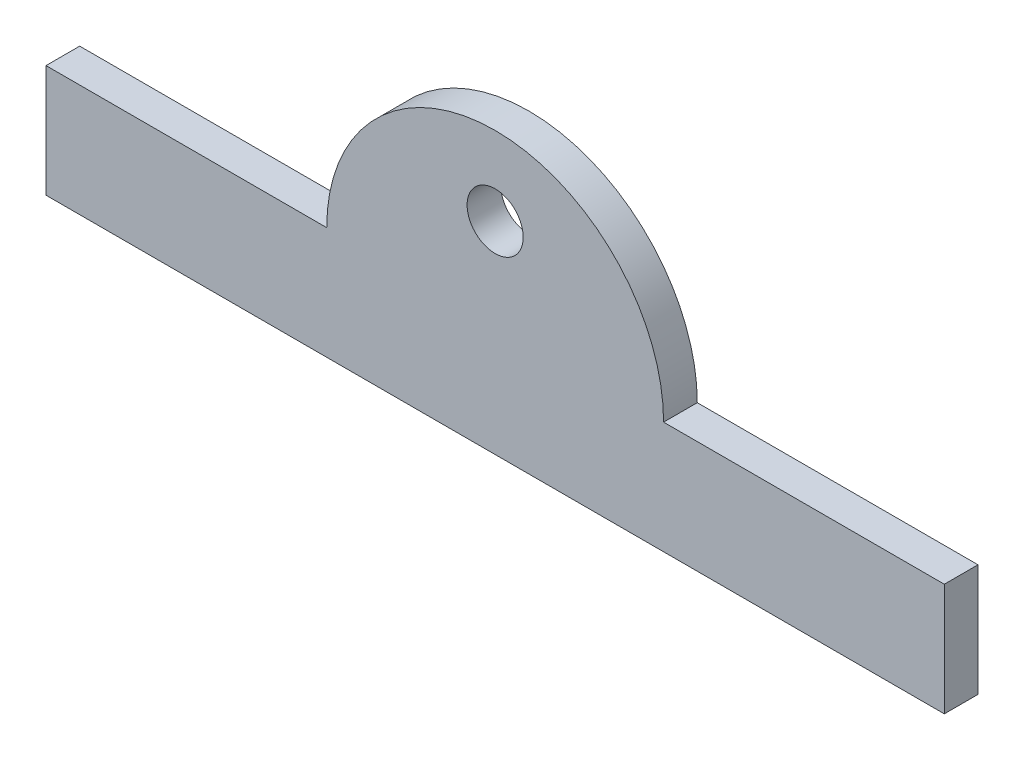
ISO-10303-21;
HEADER;
FILE_DESCRIPTION(('STEP AP214'),'2;1');
FILE_NAME('part.step','',(''),(''),'','','');
FILE_SCHEMA(('AUTOMOTIVE_DESIGN { 1 0 10303 214 1 1 1 1 }'));
ENDSEC;
DATA;
#1=APPLICATION_CONTEXT('core data for automotive mechanical design processes');
#2=APPLICATION_PROTOCOL_DEFINITION('international standard','automotive_design',2000,#1);
#3=PRODUCT_CONTEXT('',#1,'mechanical');
#4=PRODUCT('Part','Part','',(#3));
#5=PRODUCT_RELATED_PRODUCT_CATEGORY('part','',(#4));
#6=PRODUCT_DEFINITION_FORMATION('','',#4);
#7=PRODUCT_DEFINITION_CONTEXT('part definition',#1,'design');
#8=PRODUCT_DEFINITION('design','',#6,#7);
#9=PRODUCT_DEFINITION_SHAPE('','',#8);
#10=(LENGTH_UNIT() NAMED_UNIT(*) SI_UNIT(.MILLI.,.METRE.));
#11=(NAMED_UNIT(*) PLANE_ANGLE_UNIT() SI_UNIT($,.RADIAN.));
#12=(NAMED_UNIT(*) SI_UNIT($,.STERADIAN.) SOLID_ANGLE_UNIT());
#13=UNCERTAINTY_MEASURE_WITH_UNIT(LENGTH_MEASURE(1.E-05),#10,'distance_accuracy_value','');
#14=(GEOMETRIC_REPRESENTATION_CONTEXT(3) GLOBAL_UNCERTAINTY_ASSIGNED_CONTEXT((#13)) GLOBAL_UNIT_ASSIGNED_CONTEXT((#10,
#11,#12)) REPRESENTATION_CONTEXT('',''));
#15=CARTESIAN_POINT('',(0.,0.,0.));
#16=DIRECTION('',(0.,0.,1.));
#17=DIRECTION('',(1.,0.,0.));
#18=AXIS2_PLACEMENT_3D('',#15,#16,#17);
#19=CARTESIAN_POINT('',(0.,5.,0.));
#20=DIRECTION('',(0.,-1.,0.));
#21=DIRECTION('',(0.,0.,-1.));
#22=AXIS2_PLACEMENT_3D('',#19,#20,#21);
#23=PLANE('',#22);
#24=DIRECTION('',(0.,0.,-1.));
#25=VECTOR('',#24,1.);
#26=CARTESIAN_POINT('',(-15.,5.,1.5));
#27=LINE('',#26,#25);
#28=CARTESIAN_POINT('',(-15.,5.,1.5));
#29=VERTEX_POINT('',#28);
#30=CARTESIAN_POINT('',(-15.,5.,-1.5));
#31=VERTEX_POINT('',#30);
#32=EDGE_CURVE('E107',#29,#31,#27,.T.);
#33=ORIENTED_EDGE('',*,*,#32,.T.);
#34=DIRECTION('',(-1.,0.,0.));
#35=VECTOR('',#34,1.);
#36=CARTESIAN_POINT('',(-40.0000000000001,5.,-1.5));
#37=LINE('',#36,#35);
#38=CARTESIAN_POINT('',(-40.0000000000001,5.,-1.5));
#39=VERTEX_POINT('',#38);
#40=EDGE_CURVE('E98',#31,#39,#37,.T.);
#41=ORIENTED_EDGE('',*,*,#40,.T.);
#42=DIRECTION('',(0.,0.,1.));
#43=VECTOR('',#42,1.);
#44=CARTESIAN_POINT('',(-40.0000000000001,5.,1.5));
#45=LINE('',#44,#43);
#46=CARTESIAN_POINT('',(-40.0000000000001,5.,1.5));
#47=VERTEX_POINT('',#46);
#48=EDGE_CURVE('E97',#39,#47,#45,.T.);
#49=ORIENTED_EDGE('',*,*,#48,.T.);
#50=DIRECTION('',(1.,0.,0.));
#51=VECTOR('',#50,1.);
#52=CARTESIAN_POINT('',(-40.0000000000001,5.,1.5));
#53=LINE('',#52,#51);
#54=EDGE_CURVE('E62',#47,#29,#53,.T.);
#55=ORIENTED_EDGE('',*,*,#54,.T.);
#56=EDGE_LOOP('',(#33,#41,#49,#55));
#57=FACE_BOUND('',#56,.T.);
#58=ADVANCED_FACE('F39',(#57),#23,.F.);
#59=DIRECTION('',(0.,0.,-1.));
#60=VECTOR('',#59,1.);
#61=CARTESIAN_POINT('',(15.,5.,1.5));
#62=LINE('',#61,#60);
#63=CARTESIAN_POINT('',(15.,5.,1.5));
#64=VERTEX_POINT('',#63);
#65=CARTESIAN_POINT('',(15.,5.,-1.5));
#66=VERTEX_POINT('',#65);
#67=EDGE_CURVE('E54',#64,#66,#62,.T.);
#68=ORIENTED_EDGE('',*,*,#67,.F.);
#69=CARTESIAN_POINT('',(39.9999999999999,5.,1.5));
#70=VERTEX_POINT('',#69);
#71=EDGE_CURVE('E126',#64,#70,#53,.T.);
#72=ORIENTED_EDGE('',*,*,#71,.T.);
#73=DIRECTION('',(0.,0.,-1.));
#74=VECTOR('',#73,1.);
#75=CARTESIAN_POINT('',(39.9999999999999,5.,1.5));
#76=LINE('',#75,#74);
#77=CARTESIAN_POINT('',(39.9999999999999,5.,-1.5));
#78=VERTEX_POINT('',#77);
#79=EDGE_CURVE('E93',#70,#78,#76,.T.);
#80=ORIENTED_EDGE('',*,*,#79,.T.);
#81=EDGE_CURVE('E90',#78,#66,#37,.T.);
#82=ORIENTED_EDGE('',*,*,#81,.T.);
#83=EDGE_LOOP('',(#68,#72,#80,#82));
#84=FACE_BOUND('',#83,.T.);
#85=ADVANCED_FACE('F91',(#84),#23,.F.);
#86=CARTESIAN_POINT('',(39.9999999999999,5.,1.5));
#87=DIRECTION('',(-1.,0.,0.));
#88=DIRECTION('',(0.,0.,1.));
#89=AXIS2_PLACEMENT_3D('',#86,#87,#88);
#90=PLANE('',#89);
#91=DIRECTION('',(0.,0.,-1.));
#92=VECTOR('',#91,1.);
#93=CARTESIAN_POINT('',(39.9999999999999,-5.,1.5));
#94=LINE('',#93,#92);
#95=CARTESIAN_POINT('',(39.9999999999999,-5.,1.5));
#96=VERTEX_POINT('',#95);
#97=CARTESIAN_POINT('',(39.9999999999999,-5.,-1.5));
#98=VERTEX_POINT('',#97);
#99=EDGE_CURVE('E122',#96,#98,#94,.T.);
#100=ORIENTED_EDGE('',*,*,#99,.T.);
#101=DIRECTION('',(0.,-1.,0.));
#102=VECTOR('',#101,1.);
#103=CARTESIAN_POINT('',(39.9999999999999,5.,-1.5));
#104=LINE('',#103,#102);
#105=EDGE_CURVE('E11',#78,#98,#104,.T.);
#106=ORIENTED_EDGE('',*,*,#105,.F.);
#107=ORIENTED_EDGE('',*,*,#79,.F.);
#108=DIRECTION('',(0.,-1.,0.));
#109=VECTOR('',#108,1.);
#110=CARTESIAN_POINT('',(39.9999999999999,5.,1.5));
#111=LINE('',#110,#109);
#112=EDGE_CURVE('E128',#70,#96,#111,.T.);
#113=ORIENTED_EDGE('',*,*,#112,.T.);
#114=EDGE_LOOP('',(#100,#106,#107,#113));
#115=FACE_BOUND('',#114,.T.);
#116=ADVANCED_FACE('F41',(#115),#90,.F.);
#117=CARTESIAN_POINT('',(-40.0000000000001,5.,-1.5));
#118=DIRECTION('',(0.,0.,1.));
#119=DIRECTION('',(1.,0.,0.));
#120=AXIS2_PLACEMENT_3D('',#117,#118,#119);
#121=PLANE('',#120);
#122=DIRECTION('',(-1.,0.,0.));
#123=VECTOR('',#122,1.);
#124=CARTESIAN_POINT('',(-40.0000000000001,-5.,-1.5));
#125=LINE('',#124,#123);
#126=CARTESIAN_POINT('',(-40.0000000000001,-5.,-1.5));
#127=VERTEX_POINT('',#126);
#128=EDGE_CURVE('E131',#98,#127,#125,.T.);
#129=ORIENTED_EDGE('',*,*,#128,.T.);
#130=DIRECTION('',(0.,-1.,0.));
#131=VECTOR('',#130,1.);
#132=CARTESIAN_POINT('',(-40.0000000000001,5.,-1.5));
#133=LINE('',#132,#131);
#134=EDGE_CURVE('E47',#39,#127,#133,.T.);
#135=ORIENTED_EDGE('',*,*,#134,.F.);
#136=ORIENTED_EDGE('',*,*,#40,.F.);
#137=CARTESIAN_POINT('',(0.,5.,-1.5));
#138=DIRECTION('',(0.,0.,1.));
#139=DIRECTION('',(1.,0.,0.));
#140=AXIS2_PLACEMENT_3D('',#137,#138,#139);
#141=CIRCLE('',#140,15.);
#142=EDGE_CURVE('E105',#66,#31,#141,.T.);
#143=ORIENTED_EDGE('',*,*,#142,.F.);
#144=ORIENTED_EDGE('',*,*,#81,.F.);
#145=ORIENTED_EDGE('',*,*,#105,.T.);
#146=EDGE_LOOP('',(#129,#135,#136,#143,#144,#145));
#147=FACE_BOUND('',#146,.T.);
#148=CARTESIAN_POINT('',(0.,13.,-1.5));
#149=DIRECTION('',(0.,0.,1.));
#150=DIRECTION('',(1.,0.,0.));
#151=AXIS2_PLACEMENT_3D('',#148,#149,#150);
#152=CIRCLE('',#151,2.5);
#153=CARTESIAN_POINT('',(2.5,13.,-1.5));
#154=VERTEX_POINT('',#153);
#155=EDGE_CURVE('E117',#154,#154,#152,.T.);
#156=ORIENTED_EDGE('',*,*,#155,.T.);
#157=EDGE_LOOP('',(#156));
#158=FACE_BOUND('',#157,.T.);
#159=ADVANCED_FACE('F110',(#147,#158),#121,.F.);
#160=CARTESIAN_POINT('',(-40.0000000000001,5.,1.5));
#161=DIRECTION('',(1.,0.,0.));
#162=DIRECTION('',(0.,0.,-1.));
#163=AXIS2_PLACEMENT_3D('',#160,#161,#162);
#164=PLANE('',#163);
#165=DIRECTION('',(0.,0.,1.));
#166=VECTOR('',#165,1.);
#167=CARTESIAN_POINT('',(-40.0000000000001,-5.,1.5));
#168=LINE('',#167,#166);
#169=CARTESIAN_POINT('',(-40.0000000000001,-5.,1.5));
#170=VERTEX_POINT('',#169);
#171=EDGE_CURVE('E133',#127,#170,#168,.T.);
#172=ORIENTED_EDGE('',*,*,#171,.T.);
#173=DIRECTION('',(0.,-1.,0.));
#174=VECTOR('',#173,1.);
#175=CARTESIAN_POINT('',(-40.0000000000001,5.,1.5));
#176=LINE('',#175,#174);
#177=EDGE_CURVE('E138',#47,#170,#176,.T.);
#178=ORIENTED_EDGE('',*,*,#177,.F.);
#179=ORIENTED_EDGE('',*,*,#48,.F.);
#180=ORIENTED_EDGE('',*,*,#134,.T.);
#181=EDGE_LOOP('',(#172,#178,#179,#180));
#182=FACE_BOUND('',#181,.T.);
#183=ADVANCED_FACE('F144',(#182),#164,.F.);
#184=CARTESIAN_POINT('',(-40.0000000000001,5.,1.5));
#185=DIRECTION('',(0.,0.,-1.));
#186=DIRECTION('',(-1.,0.,0.));
#187=AXIS2_PLACEMENT_3D('',#184,#185,#186);
#188=PLANE('',#187);
#189=DIRECTION('',(1.,0.,0.));
#190=VECTOR('',#189,1.);
#191=CARTESIAN_POINT('',(-40.0000000000001,-5.,1.5));
#192=LINE('',#191,#190);
#193=EDGE_CURVE('E123',#170,#96,#192,.T.);
#194=ORIENTED_EDGE('',*,*,#193,.T.);
#195=ORIENTED_EDGE('',*,*,#112,.F.);
#196=ORIENTED_EDGE('',*,*,#71,.F.);
#197=CARTESIAN_POINT('',(0.,5.,1.5));
#198=DIRECTION('',(0.,0.,1.));
#199=DIRECTION('',(1.,0.,0.));
#200=AXIS2_PLACEMENT_3D('',#197,#198,#199);
#201=CIRCLE('',#200,15.);
#202=EDGE_CURVE('E106',#64,#29,#201,.T.);
#203=ORIENTED_EDGE('',*,*,#202,.T.);
#204=ORIENTED_EDGE('',*,*,#54,.F.);
#205=ORIENTED_EDGE('',*,*,#177,.T.);
#206=EDGE_LOOP('',(#194,#195,#196,#203,#204,#205));
#207=FACE_BOUND('',#206,.T.);
#208=CARTESIAN_POINT('',(0.,13.,1.5));
#209=DIRECTION('',(0.,0.,1.));
#210=DIRECTION('',(1.,0.,0.));
#211=AXIS2_PLACEMENT_3D('',#208,#209,#210);
#212=CIRCLE('',#211,2.5);
#213=CARTESIAN_POINT('',(2.5,13.,1.5));
#214=VERTEX_POINT('',#213);
#215=EDGE_CURVE('E113',#214,#214,#212,.T.);
#216=ORIENTED_EDGE('',*,*,#215,.F.);
#217=EDGE_LOOP('',(#216));
#218=FACE_BOUND('',#217,.T.);
#219=ADVANCED_FACE('F152',(#207,#218),#188,.F.);
#220=CARTESIAN_POINT('',(0.,-5.,0.));
#221=DIRECTION('',(0.,-1.,0.));
#222=DIRECTION('',(0.,0.,-1.));
#223=AXIS2_PLACEMENT_3D('',#220,#221,#222);
#224=PLANE('',#223);
#225=ORIENTED_EDGE('',*,*,#99,.F.);
#226=ORIENTED_EDGE('',*,*,#193,.F.);
#227=ORIENTED_EDGE('',*,*,#171,.F.);
#228=ORIENTED_EDGE('',*,*,#128,.F.);
#229=EDGE_LOOP('',(#225,#226,#227,#228));
#230=FACE_BOUND('',#229,.T.);
#231=ADVANCED_FACE('F149',(#230),#224,.T.);
#232=CARTESIAN_POINT('',(0.,5.,1.5));
#233=DIRECTION('',(0.,0.,-1.));
#234=DIRECTION('',(-1.,0.,0.));
#235=AXIS2_PLACEMENT_3D('',#232,#233,#234);
#236=CYLINDRICAL_SURFACE('',#235,15.);
#237=ORIENTED_EDGE('',*,*,#142,.T.);
#238=ORIENTED_EDGE('',*,*,#32,.F.);
#239=ORIENTED_EDGE('',*,*,#202,.F.);
#240=ORIENTED_EDGE('',*,*,#67,.T.);
#241=EDGE_LOOP('',(#237,#238,#239,#240));
#242=FACE_BOUND('',#241,.T.);
#243=ADVANCED_FACE('F103',(#242),#236,.T.);
#244=CARTESIAN_POINT('',(0.,13.,1.5));
#245=DIRECTION('',(0.,0.,-1.));
#246=DIRECTION('',(-1.,0.,0.));
#247=AXIS2_PLACEMENT_3D('',#244,#245,#246);
#248=CYLINDRICAL_SURFACE('',#247,2.5);
#249=ORIENTED_EDGE('',*,*,#215,.T.);
#250=EDGE_LOOP('',(#249));
#251=FACE_BOUND('',#250,.T.);
#252=ORIENTED_EDGE('',*,*,#155,.F.);
#253=EDGE_LOOP('',(#252));
#254=FACE_BOUND('',#253,.T.);
#255=ADVANCED_FACE('F190',(#251,#254),#248,.F.);
#256=CLOSED_SHELL('',(#58,#85,#116,#159,#183,#219,#231,#243,#255));
#257=MANIFOLD_SOLID_BREP('B2',#256);
#258=ADVANCED_BREP_SHAPE_REPRESENTATION('',(#18,#257),#14);
#259=SHAPE_DEFINITION_REPRESENTATION(#9,#258);
ENDSEC;
END-ISO-10303-21;
